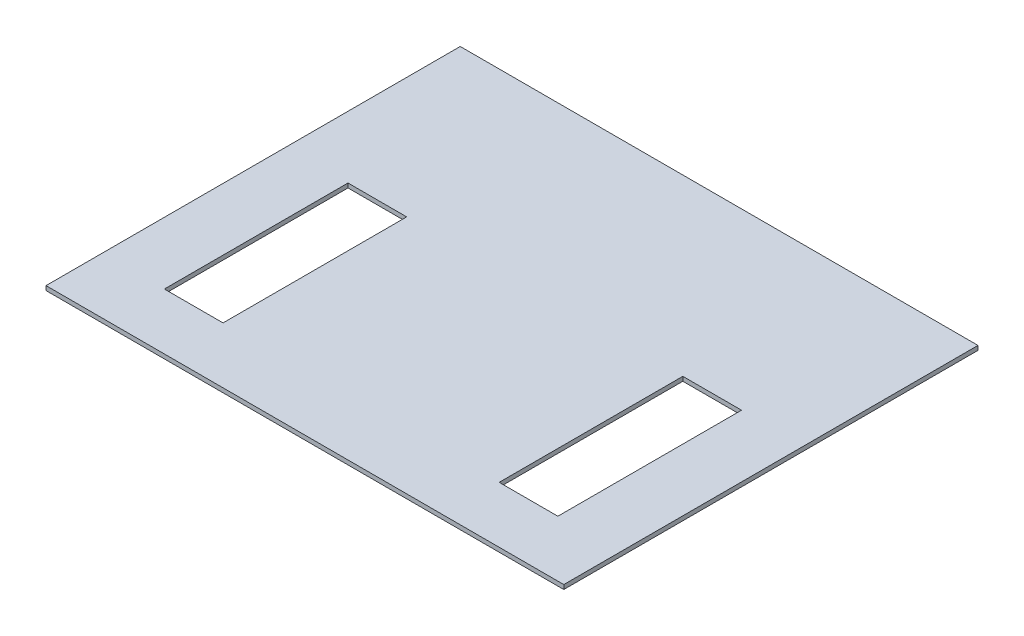
ISO-10303-21;
HEADER;
FILE_DESCRIPTION(('STEP AP214'),'2;1');
FILE_NAME('part.step','',(''),(''),'','','');
FILE_SCHEMA(('AUTOMOTIVE_DESIGN { 1 0 10303 214 1 1 1 1 }'));
ENDSEC;
DATA;
#1=APPLICATION_CONTEXT('core data for automotive mechanical design processes');
#2=APPLICATION_PROTOCOL_DEFINITION('international standard','automotive_design',2000,#1);
#3=PRODUCT_CONTEXT('',#1,'mechanical');
#4=PRODUCT('Part','Part','',(#3));
#5=PRODUCT_RELATED_PRODUCT_CATEGORY('part','',(#4));
#6=PRODUCT_DEFINITION_FORMATION('','',#4);
#7=PRODUCT_DEFINITION_CONTEXT('part definition',#1,'design');
#8=PRODUCT_DEFINITION('design','',#6,#7);
#9=PRODUCT_DEFINITION_SHAPE('','',#8);
#10=(LENGTH_UNIT() NAMED_UNIT(*) SI_UNIT(.MILLI.,.METRE.));
#11=(NAMED_UNIT(*) PLANE_ANGLE_UNIT() SI_UNIT($,.RADIAN.));
#12=(NAMED_UNIT(*) SI_UNIT($,.STERADIAN.) SOLID_ANGLE_UNIT());
#13=UNCERTAINTY_MEASURE_WITH_UNIT(LENGTH_MEASURE(1.E-05),#10,'distance_accuracy_value','');
#14=(GEOMETRIC_REPRESENTATION_CONTEXT(3) GLOBAL_UNCERTAINTY_ASSIGNED_CONTEXT((#13)) GLOBAL_UNIT_ASSIGNED_CONTEXT((#10,
#11,#12)) REPRESENTATION_CONTEXT('',''));
#15=CARTESIAN_POINT('',(0.,0.,0.));
#16=DIRECTION('',(0.,0.,1.));
#17=DIRECTION('',(1.,0.,0.));
#18=AXIS2_PLACEMENT_3D('',#15,#16,#17);
#19=CARTESIAN_POINT('',(0.,0.,0.));
#20=DIRECTION('',(0.,0.,1.));
#21=DIRECTION('',(1.,0.,0.));
#22=AXIS2_PLACEMENT_3D('',#19,#20,#21);
#23=PLANE('',#22);
#24=DIRECTION('',(0.,1.,0.));
#25=VECTOR('',#24,1.);
#26=CARTESIAN_POINT('',(190.5,3.175,0.));
#27=LINE('',#26,#25);
#28=CARTESIAN_POINT('',(190.5,0.,1.11022302462516E-13));
#29=VERTEX_POINT('',#28);
#30=CARTESIAN_POINT('',(190.5,3.175,1.11022302462516E-13));
#31=VERTEX_POINT('',#30);
#32=EDGE_CURVE('E47',#29,#31,#27,.T.);
#33=ORIENTED_EDGE('',*,*,#32,.F.);
#34=DIRECTION('',(-1.,0.,0.));
#35=VECTOR('',#34,1.);
#36=CARTESIAN_POINT('',(0.,0.,0.));
#37=LINE('',#36,#35);
#38=CARTESIAN_POINT('',(-190.5,0.,1.11022302462516E-13));
#39=VERTEX_POINT('',#38);
#40=EDGE_CURVE('E11',#29,#39,#37,.T.);
#41=ORIENTED_EDGE('',*,*,#40,.T.);
#42=DIRECTION('',(0.,-1.,0.));
#43=VECTOR('',#42,1.);
#44=CARTESIAN_POINT('',(-190.5,3.175,0.));
#45=LINE('',#44,#43);
#46=CARTESIAN_POINT('',(-190.5,3.175,1.11022302462516E-13));
#47=VERTEX_POINT('',#46);
#48=EDGE_CURVE('E61',#47,#39,#45,.T.);
#49=ORIENTED_EDGE('',*,*,#48,.F.);
#50=DIRECTION('',(-1.,0.,0.));
#51=VECTOR('',#50,1.);
#52=CARTESIAN_POINT('',(0.,3.175,0.));
#53=LINE('',#52,#51);
#54=EDGE_CURVE('E42',#31,#47,#53,.T.);
#55=ORIENTED_EDGE('',*,*,#54,.F.);
#56=EDGE_LOOP('',(#33,#41,#49,#55));
#57=FACE_BOUND('',#56,.T.);
#58=ADVANCED_FACE('F39',(#57),#23,.F.);
#59=CARTESIAN_POINT('',(190.5,3.175,304.8));
#60=DIRECTION('',(-1.,0.,0.));
#61=DIRECTION('',(0.,0.,1.));
#62=AXIS2_PLACEMENT_3D('',#59,#60,#61);
#63=PLANE('',#62);
#64=DIRECTION('',(0.,0.,-1.));
#65=VECTOR('',#64,1.);
#66=CARTESIAN_POINT('',(190.5,0.,304.8));
#67=LINE('',#66,#65);
#68=CARTESIAN_POINT('',(190.5,0.,304.8));
#69=VERTEX_POINT('',#68);
#70=EDGE_CURVE('E194',#69,#29,#67,.T.);
#71=ORIENTED_EDGE('',*,*,#70,.T.);
#72=ORIENTED_EDGE('',*,*,#32,.T.);
#73=DIRECTION('',(0.,0.,-1.));
#74=VECTOR('',#73,1.);
#75=CARTESIAN_POINT('',(190.5,3.175,304.8));
#76=LINE('',#75,#74);
#77=CARTESIAN_POINT('',(190.5,3.175,304.8));
#78=VERTEX_POINT('',#77);
#79=EDGE_CURVE('E201',#78,#31,#76,.T.);
#80=ORIENTED_EDGE('',*,*,#79,.F.);
#81=DIRECTION('',(0.,-1.,0.));
#82=VECTOR('',#81,1.);
#83=CARTESIAN_POINT('',(190.5,3.175,304.8));
#84=LINE('',#83,#82);
#85=EDGE_CURVE('E209',#78,#69,#84,.T.);
#86=ORIENTED_EDGE('',*,*,#85,.T.);
#87=EDGE_LOOP('',(#71,#72,#80,#86));
#88=FACE_BOUND('',#87,.T.);
#89=ADVANCED_FACE('F223',(#88),#63,.F.);
#90=CARTESIAN_POINT('',(-190.5,3.175,304.8));
#91=DIRECTION('',(1.,0.,0.));
#92=DIRECTION('',(0.,0.,-1.));
#93=AXIS2_PLACEMENT_3D('',#90,#91,#92);
#94=PLANE('',#93);
#95=DIRECTION('',(0.,0.,1.));
#96=VECTOR('',#95,1.);
#97=CARTESIAN_POINT('',(-190.5,3.175,304.8));
#98=LINE('',#97,#96);
#99=CARTESIAN_POINT('',(-190.5,3.175,304.8));
#100=VERTEX_POINT('',#99);
#101=EDGE_CURVE('E204',#47,#100,#98,.T.);
#102=ORIENTED_EDGE('',*,*,#101,.F.);
#103=ORIENTED_EDGE('',*,*,#48,.T.);
#104=DIRECTION('',(0.,0.,1.));
#105=VECTOR('',#104,1.);
#106=CARTESIAN_POINT('',(-190.5,0.,304.8));
#107=LINE('',#106,#105);
#108=CARTESIAN_POINT('',(-190.5,0.,304.8));
#109=VERTEX_POINT('',#108);
#110=EDGE_CURVE('E212',#39,#109,#107,.T.);
#111=ORIENTED_EDGE('',*,*,#110,.T.);
#112=DIRECTION('',(0.,-1.,0.));
#113=VECTOR('',#112,1.);
#114=CARTESIAN_POINT('',(-190.5,3.175,304.8));
#115=LINE('',#114,#113);
#116=EDGE_CURVE('E217',#100,#109,#115,.T.);
#117=ORIENTED_EDGE('',*,*,#116,.F.);
#118=EDGE_LOOP('',(#102,#103,#111,#117));
#119=FACE_BOUND('',#118,.T.);
#120=ADVANCED_FACE('F234',(#119),#94,.F.);
#121=CARTESIAN_POINT('',(-190.5,3.175,304.8));
#122=DIRECTION('',(0.,0.,-1.));
#123=DIRECTION('',(-1.,0.,0.));
#124=AXIS2_PLACEMENT_3D('',#121,#122,#123);
#125=PLANE('',#124);
#126=DIRECTION('',(1.,0.,0.));
#127=VECTOR('',#126,1.);
#128=CARTESIAN_POINT('',(-190.5,0.,304.8));
#129=LINE('',#128,#127);
#130=EDGE_CURVE('E205',#109,#69,#129,.T.);
#131=ORIENTED_EDGE('',*,*,#130,.T.);
#132=ORIENTED_EDGE('',*,*,#85,.F.);
#133=DIRECTION('',(1.,0.,0.));
#134=VECTOR('',#133,1.);
#135=CARTESIAN_POINT('',(-190.5,3.175,304.8));
#136=LINE('',#135,#134);
#137=EDGE_CURVE('E207',#100,#78,#136,.T.);
#138=ORIENTED_EDGE('',*,*,#137,.F.);
#139=ORIENTED_EDGE('',*,*,#116,.T.);
#140=EDGE_LOOP('',(#131,#132,#138,#139));
#141=FACE_BOUND('',#140,.T.);
#142=ADVANCED_FACE('F230',(#141),#125,.F.);
#143=CARTESIAN_POINT('',(0.,3.175,0.));
#144=DIRECTION('',(0.,-1.,0.));
#145=DIRECTION('',(0.,0.,-1.));
#146=AXIS2_PLACEMENT_3D('',#143,#144,#145);
#147=PLANE('',#146);
#148=DIRECTION('',(0.,0.,-1.));
#149=VECTOR('',#148,1.);
#150=CARTESIAN_POINT('',(-101.6,3.175,263.4234));
#151=LINE('',#150,#149);
#152=CARTESIAN_POINT('',(-101.6,3.175,263.4234));
#153=VERTEX_POINT('',#152);
#154=CARTESIAN_POINT('',(-101.6,3.175,128.2954));
#155=VERTEX_POINT('',#154);
#156=EDGE_CURVE('E153',#153,#155,#151,.T.);
#157=ORIENTED_EDGE('',*,*,#156,.F.);
#158=DIRECTION('',(1.,0.,0.));
#159=VECTOR('',#158,1.);
#160=CARTESIAN_POINT('',(-101.6,3.175,263.4234));
#161=LINE('',#160,#159);
#162=CARTESIAN_POINT('',(-144.78,3.175,263.4234));
#163=VERTEX_POINT('',#162);
#164=EDGE_CURVE('E132',#163,#153,#161,.T.);
#165=ORIENTED_EDGE('',*,*,#164,.F.);
#166=DIRECTION('',(0.,0.,1.));
#167=VECTOR('',#166,1.);
#168=CARTESIAN_POINT('',(-144.78,3.175,263.4234));
#169=LINE('',#168,#167);
#170=CARTESIAN_POINT('',(-144.78,3.175,128.2954));
#171=VERTEX_POINT('',#170);
#172=EDGE_CURVE('E142',#171,#163,#169,.T.);
#173=ORIENTED_EDGE('',*,*,#172,.F.);
#174=DIRECTION('',(-1.,0.,0.));
#175=VECTOR('',#174,1.);
#176=CARTESIAN_POINT('',(-101.6,3.175,128.2954));
#177=LINE('',#176,#175);
#178=EDGE_CURVE('E147',#155,#171,#177,.T.);
#179=ORIENTED_EDGE('',*,*,#178,.F.);
#180=EDGE_LOOP('',(#157,#165,#173,#179));
#181=FACE_BOUND('',#180,.T.);
#182=DIRECTION('',(-1.,0.,0.));
#183=VECTOR('',#182,1.);
#184=CARTESIAN_POINT('',(101.6,3.175,128.2954));
#185=LINE('',#184,#183);
#186=CARTESIAN_POINT('',(144.78,3.175,128.2954));
#187=VERTEX_POINT('',#186);
#188=CARTESIAN_POINT('',(101.6,3.175,128.2954));
#189=VERTEX_POINT('',#188);
#190=EDGE_CURVE('E156',#187,#189,#185,.T.);
#191=ORIENTED_EDGE('',*,*,#190,.F.);
#192=DIRECTION('',(0.,0.,-1.));
#193=VECTOR('',#192,1.);
#194=CARTESIAN_POINT('',(144.78,3.175,263.4234));
#195=LINE('',#194,#193);
#196=CARTESIAN_POINT('',(144.78,3.175,263.4234));
#197=VERTEX_POINT('',#196);
#198=EDGE_CURVE('E154',#197,#187,#195,.T.);
#199=ORIENTED_EDGE('',*,*,#198,.F.);
#200=DIRECTION('',(1.,0.,0.));
#201=VECTOR('',#200,1.);
#202=CARTESIAN_POINT('',(101.6,3.175,263.4234));
#203=LINE('',#202,#201);
#204=CARTESIAN_POINT('',(101.6,3.175,263.4234));
#205=VERTEX_POINT('',#204);
#206=EDGE_CURVE('E175',#205,#197,#203,.T.);
#207=ORIENTED_EDGE('',*,*,#206,.F.);
#208=DIRECTION('',(0.,0.,1.));
#209=VECTOR('',#208,1.);
#210=CARTESIAN_POINT('',(101.6,3.175,263.4234));
#211=LINE('',#210,#209);
#212=EDGE_CURVE('E187',#189,#205,#211,.T.);
#213=ORIENTED_EDGE('',*,*,#212,.F.);
#214=EDGE_LOOP('',(#191,#199,#207,#213));
#215=FACE_BOUND('',#214,.T.);
#216=ORIENTED_EDGE('',*,*,#79,.T.);
#217=ORIENTED_EDGE('',*,*,#54,.T.);
#218=ORIENTED_EDGE('',*,*,#101,.T.);
#219=ORIENTED_EDGE('',*,*,#137,.T.);
#220=EDGE_LOOP('',(#216,#217,#218,#219));
#221=FACE_BOUND('',#220,.T.);
#222=ADVANCED_FACE('F150',(#181,#215,#221),#147,.F.);
#223=CARTESIAN_POINT('',(0.,0.,0.));
#224=DIRECTION('',(0.,-1.,0.));
#225=DIRECTION('',(0.,0.,-1.));
#226=AXIS2_PLACEMENT_3D('',#223,#224,#225);
#227=PLANE('',#226);
#228=ORIENTED_EDGE('',*,*,#40,.F.);
#229=ORIENTED_EDGE('',*,*,#70,.F.);
#230=ORIENTED_EDGE('',*,*,#130,.F.);
#231=ORIENTED_EDGE('',*,*,#110,.F.);
#232=EDGE_LOOP('',(#228,#229,#230,#231));
#233=FACE_BOUND('',#232,.T.);
#234=DIRECTION('',(1.,0.,0.));
#235=VECTOR('',#234,1.);
#236=CARTESIAN_POINT('',(-101.6,0.,263.4234));
#237=LINE('',#236,#235);
#238=CARTESIAN_POINT('',(-144.78,0.,263.4234));
#239=VERTEX_POINT('',#238);
#240=CARTESIAN_POINT('',(-101.6,0.,263.4234));
#241=VERTEX_POINT('',#240);
#242=EDGE_CURVE('E135',#239,#241,#237,.T.);
#243=ORIENTED_EDGE('',*,*,#242,.T.);
#244=DIRECTION('',(0.,0.,-1.));
#245=VECTOR('',#244,1.);
#246=CARTESIAN_POINT('',(-101.6,0.,263.4234));
#247=LINE('',#246,#245);
#248=CARTESIAN_POINT('',(-101.6,0.,128.2954));
#249=VERTEX_POINT('',#248);
#250=EDGE_CURVE('E167',#241,#249,#247,.T.);
#251=ORIENTED_EDGE('',*,*,#250,.T.);
#252=DIRECTION('',(-1.,0.,0.));
#253=VECTOR('',#252,1.);
#254=CARTESIAN_POINT('',(-101.6,0.,128.2954));
#255=LINE('',#254,#253);
#256=CARTESIAN_POINT('',(-144.78,0.,128.2954));
#257=VERTEX_POINT('',#256);
#258=EDGE_CURVE('E163',#249,#257,#255,.T.);
#259=ORIENTED_EDGE('',*,*,#258,.T.);
#260=DIRECTION('',(0.,0.,1.));
#261=VECTOR('',#260,1.);
#262=CARTESIAN_POINT('',(-144.78,0.,263.4234));
#263=LINE('',#262,#261);
#264=EDGE_CURVE('E161',#257,#239,#263,.T.);
#265=ORIENTED_EDGE('',*,*,#264,.T.);
#266=EDGE_LOOP('',(#243,#251,#259,#265));
#267=FACE_BOUND('',#266,.T.);
#268=DIRECTION('',(0.,0.,-1.));
#269=VECTOR('',#268,1.);
#270=CARTESIAN_POINT('',(144.78,0.,263.4234));
#271=LINE('',#270,#269);
#272=CARTESIAN_POINT('',(144.78,0.,263.4234));
#273=VERTEX_POINT('',#272);
#274=CARTESIAN_POINT('',(144.78,0.,128.2954));
#275=VERTEX_POINT('',#274);
#276=EDGE_CURVE('E171',#273,#275,#271,.T.);
#277=ORIENTED_EDGE('',*,*,#276,.T.);
#278=DIRECTION('',(-1.,0.,0.));
#279=VECTOR('',#278,1.);
#280=CARTESIAN_POINT('',(101.6,0.,128.2954));
#281=LINE('',#280,#279);
#282=CARTESIAN_POINT('',(101.6,0.,128.2954));
#283=VERTEX_POINT('',#282);
#284=EDGE_CURVE('E174',#275,#283,#281,.T.);
#285=ORIENTED_EDGE('',*,*,#284,.T.);
#286=DIRECTION('',(0.,0.,1.));
#287=VECTOR('',#286,1.);
#288=CARTESIAN_POINT('',(101.6,0.,263.4234));
#289=LINE('',#288,#287);
#290=CARTESIAN_POINT('',(101.6,0.,263.4234));
#291=VERTEX_POINT('',#290);
#292=EDGE_CURVE('E178',#283,#291,#289,.T.);
#293=ORIENTED_EDGE('',*,*,#292,.T.);
#294=DIRECTION('',(1.,0.,0.));
#295=VECTOR('',#294,1.);
#296=CARTESIAN_POINT('',(101.6,0.,263.4234));
#297=LINE('',#296,#295);
#298=EDGE_CURVE('E181',#291,#273,#297,.T.);
#299=ORIENTED_EDGE('',*,*,#298,.T.);
#300=EDGE_LOOP('',(#277,#285,#293,#299));
#301=FACE_BOUND('',#300,.T.);
#302=ADVANCED_FACE('F232',(#233,#267,#301),#227,.T.);
#303=CARTESIAN_POINT('',(144.78,0.,263.4234));
#304=DIRECTION('',(1.,0.,0.));
#305=DIRECTION('',(0.,0.,-1.));
#306=AXIS2_PLACEMENT_3D('',#303,#304,#305);
#307=PLANE('',#306);
#308=ORIENTED_EDGE('',*,*,#198,.T.);
#309=DIRECTION('',(0.,1.,0.));
#310=VECTOR('',#309,1.);
#311=CARTESIAN_POINT('',(144.78,0.,128.2954));
#312=LINE('',#311,#310);
#313=EDGE_CURVE('E183',#275,#187,#312,.T.);
#314=ORIENTED_EDGE('',*,*,#313,.F.);
#315=ORIENTED_EDGE('',*,*,#276,.F.);
#316=DIRECTION('',(0.,1.,0.));
#317=VECTOR('',#316,1.);
#318=CARTESIAN_POINT('',(144.78,0.,263.4234));
#319=LINE('',#318,#317);
#320=EDGE_CURVE('E192',#273,#197,#319,.T.);
#321=ORIENTED_EDGE('',*,*,#320,.T.);
#322=EDGE_LOOP('',(#308,#314,#315,#321));
#323=FACE_BOUND('',#322,.T.);
#324=ADVANCED_FACE('F266',(#323),#307,.F.);
#325=CARTESIAN_POINT('',(101.6,0.,263.4234));
#326=DIRECTION('',(0.,0.,1.));
#327=DIRECTION('',(1.,0.,0.));
#328=AXIS2_PLACEMENT_3D('',#325,#326,#327);
#329=PLANE('',#328);
#330=ORIENTED_EDGE('',*,*,#206,.T.);
#331=ORIENTED_EDGE('',*,*,#320,.F.);
#332=ORIENTED_EDGE('',*,*,#298,.F.);
#333=DIRECTION('',(0.,1.,0.));
#334=VECTOR('',#333,1.);
#335=CARTESIAN_POINT('',(101.6,0.,263.4234));
#336=LINE('',#335,#334);
#337=EDGE_CURVE('E195',#291,#205,#336,.T.);
#338=ORIENTED_EDGE('',*,*,#337,.T.);
#339=EDGE_LOOP('',(#330,#331,#332,#338));
#340=FACE_BOUND('',#339,.T.);
#341=ADVANCED_FACE('F262',(#340),#329,.F.);
#342=CARTESIAN_POINT('',(101.6,0.,263.4234));
#343=DIRECTION('',(-1.,0.,0.));
#344=DIRECTION('',(0.,0.,1.));
#345=AXIS2_PLACEMENT_3D('',#342,#343,#344);
#346=PLANE('',#345);
#347=ORIENTED_EDGE('',*,*,#212,.T.);
#348=ORIENTED_EDGE('',*,*,#337,.F.);
#349=ORIENTED_EDGE('',*,*,#292,.F.);
#350=DIRECTION('',(0.,1.,0.));
#351=VECTOR('',#350,1.);
#352=CARTESIAN_POINT('',(101.6,0.,128.2954));
#353=LINE('',#352,#351);
#354=EDGE_CURVE('E197',#283,#189,#353,.T.);
#355=ORIENTED_EDGE('',*,*,#354,.T.);
#356=EDGE_LOOP('',(#347,#348,#349,#355));
#357=FACE_BOUND('',#356,.T.);
#358=ADVANCED_FACE('F265',(#357),#346,.F.);
#359=CARTESIAN_POINT('',(101.6,0.,128.2954));
#360=DIRECTION('',(0.,0.,-1.));
#361=DIRECTION('',(-1.,0.,0.));
#362=AXIS2_PLACEMENT_3D('',#359,#360,#361);
#363=PLANE('',#362);
#364=ORIENTED_EDGE('',*,*,#190,.T.);
#365=ORIENTED_EDGE('',*,*,#354,.F.);
#366=ORIENTED_EDGE('',*,*,#284,.F.);
#367=ORIENTED_EDGE('',*,*,#313,.T.);
#368=EDGE_LOOP('',(#364,#365,#366,#367));
#369=FACE_BOUND('',#368,.T.);
#370=ADVANCED_FACE('F270',(#369),#363,.F.);
#371=CARTESIAN_POINT('',(-101.6,0.,263.4234));
#372=DIRECTION('',(0.,0.,1.));
#373=DIRECTION('',(1.,0.,0.));
#374=AXIS2_PLACEMENT_3D('',#371,#372,#373);
#375=PLANE('',#374);
#376=ORIENTED_EDGE('',*,*,#164,.T.);
#377=DIRECTION('',(0.,1.,0.));
#378=VECTOR('',#377,1.);
#379=CARTESIAN_POINT('',(-101.6,0.,263.4234));
#380=LINE('',#379,#378);
#381=EDGE_CURVE('E164',#241,#153,#380,.T.);
#382=ORIENTED_EDGE('',*,*,#381,.F.);
#383=ORIENTED_EDGE('',*,*,#242,.F.);
#384=DIRECTION('',(0.,1.,0.));
#385=VECTOR('',#384,1.);
#386=CARTESIAN_POINT('',(-144.78,0.,263.4234));
#387=LINE('',#386,#385);
#388=EDGE_CURVE('E128',#239,#163,#387,.T.);
#389=ORIENTED_EDGE('',*,*,#388,.T.);
#390=EDGE_LOOP('',(#376,#382,#383,#389));
#391=FACE_BOUND('',#390,.T.);
#392=ADVANCED_FACE('F130',(#391),#375,.F.);
#393=CARTESIAN_POINT('',(-144.78,0.,263.4234));
#394=DIRECTION('',(-1.,0.,0.));
#395=DIRECTION('',(0.,0.,1.));
#396=AXIS2_PLACEMENT_3D('',#393,#394,#395);
#397=PLANE('',#396);
#398=ORIENTED_EDGE('',*,*,#172,.T.);
#399=ORIENTED_EDGE('',*,*,#388,.F.);
#400=ORIENTED_EDGE('',*,*,#264,.F.);
#401=DIRECTION('',(0.,1.,0.));
#402=VECTOR('',#401,1.);
#403=CARTESIAN_POINT('',(-144.78,0.,128.2954));
#404=LINE('',#403,#402);
#405=EDGE_CURVE('E139',#257,#171,#404,.T.);
#406=ORIENTED_EDGE('',*,*,#405,.T.);
#407=EDGE_LOOP('',(#398,#399,#400,#406));
#408=FACE_BOUND('',#407,.T.);
#409=ADVANCED_FACE('F143',(#408),#397,.F.);
#410=CARTESIAN_POINT('',(-101.6,0.,128.2954));
#411=DIRECTION('',(0.,0.,-1.));
#412=DIRECTION('',(-1.,0.,0.));
#413=AXIS2_PLACEMENT_3D('',#410,#411,#412);
#414=PLANE('',#413);
#415=ORIENTED_EDGE('',*,*,#178,.T.);
#416=ORIENTED_EDGE('',*,*,#405,.F.);
#417=ORIENTED_EDGE('',*,*,#258,.F.);
#418=DIRECTION('',(0.,1.,0.));
#419=VECTOR('',#418,1.);
#420=CARTESIAN_POINT('',(-101.6,0.,128.2954));
#421=LINE('',#420,#419);
#422=EDGE_CURVE('E368',#249,#155,#421,.T.);
#423=ORIENTED_EDGE('',*,*,#422,.T.);
#424=EDGE_LOOP('',(#415,#416,#417,#423));
#425=FACE_BOUND('',#424,.T.);
#426=ADVANCED_FACE('F249',(#425),#414,.F.);
#427=CARTESIAN_POINT('',(-101.6,0.,263.4234));
#428=DIRECTION('',(1.,0.,0.));
#429=DIRECTION('',(0.,0.,-1.));
#430=AXIS2_PLACEMENT_3D('',#427,#428,#429);
#431=PLANE('',#430);
#432=ORIENTED_EDGE('',*,*,#156,.T.);
#433=ORIENTED_EDGE('',*,*,#422,.F.);
#434=ORIENTED_EDGE('',*,*,#250,.F.);
#435=ORIENTED_EDGE('',*,*,#381,.T.);
#436=EDGE_LOOP('',(#432,#433,#434,#435));
#437=FACE_BOUND('',#436,.T.);
#438=ADVANCED_FACE('F244',(#437),#431,.F.);
#439=CLOSED_SHELL('',(#58,#89,#120,#142,#222,#302,#324,#341,#358,#370,#392,#409,#426,#438));
#440=MANIFOLD_SOLID_BREP('B2',#439);
#441=ADVANCED_BREP_SHAPE_REPRESENTATION('',(#18,#440),#14);
#442=SHAPE_DEFINITION_REPRESENTATION(#9,#441);
ENDSEC;
END-ISO-10303-21;
